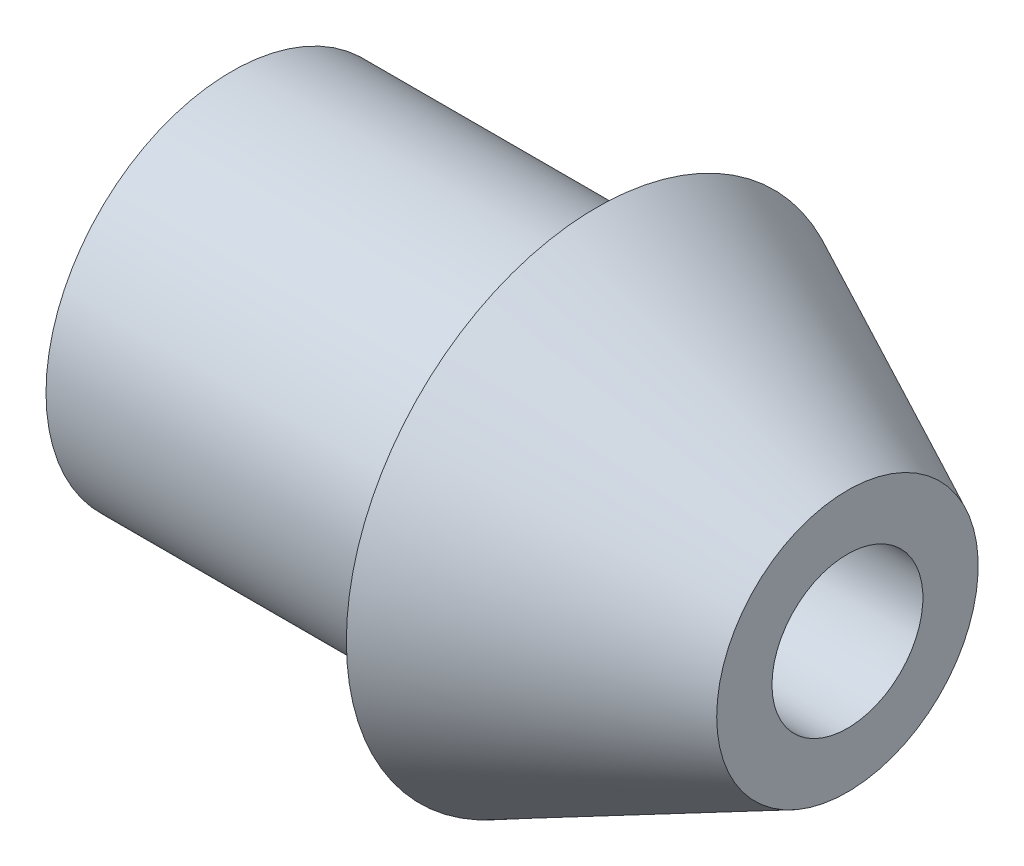
ISO-10303-21;
HEADER;
FILE_DESCRIPTION(('STEP AP214'),'2;1');
FILE_NAME('part.step','',(''),(''),'','','');
FILE_SCHEMA(('AUTOMOTIVE_DESIGN { 1 0 10303 214 1 1 1 1 }'));
ENDSEC;
DATA;
#1=APPLICATION_CONTEXT('core data for automotive mechanical design processes');
#2=APPLICATION_PROTOCOL_DEFINITION('international standard','automotive_design',2000,#1);
#3=PRODUCT_CONTEXT('',#1,'mechanical');
#4=PRODUCT('Part','Part','',(#3));
#5=PRODUCT_RELATED_PRODUCT_CATEGORY('part','',(#4));
#6=PRODUCT_DEFINITION_FORMATION('','',#4);
#7=PRODUCT_DEFINITION_CONTEXT('part definition',#1,'design');
#8=PRODUCT_DEFINITION('design','',#6,#7);
#9=PRODUCT_DEFINITION_SHAPE('','',#8);
#10=(LENGTH_UNIT() NAMED_UNIT(*) SI_UNIT(.MILLI.,.METRE.));
#11=(NAMED_UNIT(*) PLANE_ANGLE_UNIT() SI_UNIT($,.RADIAN.));
#12=(NAMED_UNIT(*) SI_UNIT($,.STERADIAN.) SOLID_ANGLE_UNIT());
#13=UNCERTAINTY_MEASURE_WITH_UNIT(LENGTH_MEASURE(1.E-05),#10,'distance_accuracy_value','');
#14=(GEOMETRIC_REPRESENTATION_CONTEXT(3) GLOBAL_UNCERTAINTY_ASSIGNED_CONTEXT((#13)) GLOBAL_UNIT_ASSIGNED_CONTEXT((#10,
#11,#12)) REPRESENTATION_CONTEXT('',''));
#15=CARTESIAN_POINT('',(0.,0.,0.));
#16=DIRECTION('',(0.,0.,1.));
#17=DIRECTION('',(1.,0.,0.));
#18=AXIS2_PLACEMENT_3D('',#15,#16,#17);
#19=CARTESIAN_POINT('',(0.,0.,0.));
#20=DIRECTION('',(-1.,0.,0.));
#21=DIRECTION('',(0.,0.,1.));
#22=AXIS2_PLACEMENT_3D('',#19,#20,#21);
#23=CYLINDRICAL_SURFACE('',#22,2.5);
#24=CARTESIAN_POINT('',(0.,0.,0.));
#25=DIRECTION('',(-1.,0.,0.));
#26=DIRECTION('',(0.,0.,1.));
#27=AXIS2_PLACEMENT_3D('',#24,#25,#26);
#28=CIRCLE('',#27,2.5);
#29=CARTESIAN_POINT('',(0.,0.,2.5));
#30=VERTEX_POINT('',#29);
#31=EDGE_CURVE('E5',#30,#30,#28,.T.);
#32=ORIENTED_EDGE('',*,*,#31,.T.);
#33=EDGE_LOOP('',(#32));
#34=FACE_BOUND('',#33,.T.);
#35=CARTESIAN_POINT('',(20.4,0.,0.));
#36=DIRECTION('',(-1.,0.,0.));
#37=DIRECTION('',(0.,0.,1.));
#38=AXIS2_PLACEMENT_3D('',#35,#36,#37);
#39=CIRCLE('',#38,2.5);
#40=CARTESIAN_POINT('',(20.4,0.,2.5));
#41=VERTEX_POINT('',#40);
#42=EDGE_CURVE('E9',#41,#41,#39,.T.);
#43=ORIENTED_EDGE('',*,*,#42,.F.);
#44=EDGE_LOOP('',(#43));
#45=FACE_BOUND('',#44,.T.);
#46=ADVANCED_FACE('F13',(#34,#45),#23,.F.);
#47=CARTESIAN_POINT('',(0.,-2.5,0.));
#48=DIRECTION('',(-1.,0.,0.));
#49=DIRECTION('',(0.,0.,1.));
#50=AXIS2_PLACEMENT_3D('',#47,#48,#49);
#51=PLANE('',#50);
#52=CARTESIAN_POINT('',(0.,0.,0.));
#53=DIRECTION('',(-1.,0.,0.));
#54=DIRECTION('',(0.,0.,1.));
#55=AXIS2_PLACEMENT_3D('',#52,#53,#54);
#56=CIRCLE('',#55,6.15);
#57=CARTESIAN_POINT('',(0.,0.,6.15));
#58=VERTEX_POINT('',#57);
#59=EDGE_CURVE('E24',#58,#58,#56,.T.);
#60=ORIENTED_EDGE('',*,*,#59,.T.);
#61=EDGE_LOOP('',(#60));
#62=FACE_BOUND('',#61,.T.);
#63=ORIENTED_EDGE('',*,*,#31,.F.);
#64=EDGE_LOOP('',(#63));
#65=FACE_BOUND('',#64,.T.);
#66=ADVANCED_FACE('F30',(#62,#65),#51,.T.);
#67=CARTESIAN_POINT('',(20.4,-4.3313730334031,0.));
#68=DIRECTION('',(1.,0.,0.));
#69=DIRECTION('',(0.,0.,-1.));
#70=AXIS2_PLACEMENT_3D('',#67,#68,#69);
#71=PLANE('',#70);
#72=ORIENTED_EDGE('',*,*,#42,.T.);
#73=EDGE_LOOP('',(#72));
#74=FACE_BOUND('',#73,.T.);
#75=CARTESIAN_POINT('',(20.4,0.,0.));
#76=DIRECTION('',(-1.,0.,0.));
#77=DIRECTION('',(0.,0.,1.));
#78=AXIS2_PLACEMENT_3D('',#75,#76,#77);
#79=CIRCLE('',#78,4.33137303340311);
#80=CARTESIAN_POINT('',(20.4,0.,4.33137303340311));
#81=VERTEX_POINT('',#80);
#82=EDGE_CURVE('E39',#81,#81,#79,.T.);
#83=ORIENTED_EDGE('',*,*,#82,.F.);
#84=EDGE_LOOP('',(#83));
#85=FACE_BOUND('',#84,.T.);
#86=ADVANCED_FACE('F43',(#74,#85),#71,.T.);
#87=CARTESIAN_POINT('',(0.,0.,0.));
#88=DIRECTION('',(-1.,0.,0.));
#89=DIRECTION('',(0.,0.,1.));
#90=AXIS2_PLACEMENT_3D('',#87,#88,#89);
#91=CYLINDRICAL_SURFACE('',#90,6.15);
#92=CARTESIAN_POINT('',(11.,0.,0.));
#93=DIRECTION('',(-1.,0.,0.));
#94=DIRECTION('',(0.,0.,1.));
#95=AXIS2_PLACEMENT_3D('',#92,#93,#94);
#96=CIRCLE('',#95,6.15);
#97=CARTESIAN_POINT('',(11.,0.,6.15));
#98=VERTEX_POINT('',#97);
#99=EDGE_CURVE('E50',#98,#98,#96,.T.);
#100=ORIENTED_EDGE('',*,*,#99,.T.);
#101=EDGE_LOOP('',(#100));
#102=FACE_BOUND('',#101,.T.);
#103=ORIENTED_EDGE('',*,*,#59,.F.);
#104=EDGE_LOOP('',(#103));
#105=FACE_BOUND('',#104,.T.);
#106=ADVANCED_FACE('F56',(#102,#105),#91,.T.);
#107=CARTESIAN_POINT('',(12.1,0.,0.));
#108=DIRECTION('',(-1.,0.,0.));
#109=DIRECTION('',(0.,0.,1.));
#110=AXIS2_PLACEMENT_3D('',#107,#108,#109);
#111=CONICAL_SURFACE('',#110,8.3,0.446013545883478);
#112=ORIENTED_EDGE('',*,*,#82,.T.);
#113=EDGE_LOOP('',(#112));
#114=FACE_BOUND('',#113,.T.);
#115=CARTESIAN_POINT('',(12.1,0.,0.));
#116=DIRECTION('',(-1.,0.,0.));
#117=DIRECTION('',(0.,0.,1.));
#118=AXIS2_PLACEMENT_3D('',#115,#116,#117);
#119=CIRCLE('',#118,8.3);
#120=CARTESIAN_POINT('',(12.1,0.,8.3));
#121=VERTEX_POINT('',#120);
#122=EDGE_CURVE('E65',#121,#121,#119,.T.);
#123=ORIENTED_EDGE('',*,*,#122,.F.);
#124=EDGE_LOOP('',(#123));
#125=FACE_BOUND('',#124,.T.);
#126=ADVANCED_FACE('F69',(#114,#125),#111,.T.);
#127=CARTESIAN_POINT('',(11.,0.,0.));
#128=DIRECTION('',(1.,0.,0.));
#129=DIRECTION('',(0.,0.,-1.));
#130=AXIS2_PLACEMENT_3D('',#127,#128,#129);
#131=CONICAL_SURFACE('',#130,6.15,1.09788972313197);
#132=ORIENTED_EDGE('',*,*,#122,.T.);
#133=EDGE_LOOP('',(#132));
#134=FACE_BOUND('',#133,.T.);
#135=ORIENTED_EDGE('',*,*,#99,.F.);
#136=EDGE_LOOP('',(#135));
#137=FACE_BOUND('',#136,.T.);
#138=ADVANCED_FACE('F80',(#134,#137),#131,.T.);
#139=CLOSED_SHELL('',(#46,#66,#86,#106,#126,#138));
#140=MANIFOLD_SOLID_BREP('B1',#139);
#141=ADVANCED_BREP_SHAPE_REPRESENTATION('',(#18,#140),#14);
#142=SHAPE_DEFINITION_REPRESENTATION(#9,#141);
ENDSEC;
END-ISO-10303-21;
